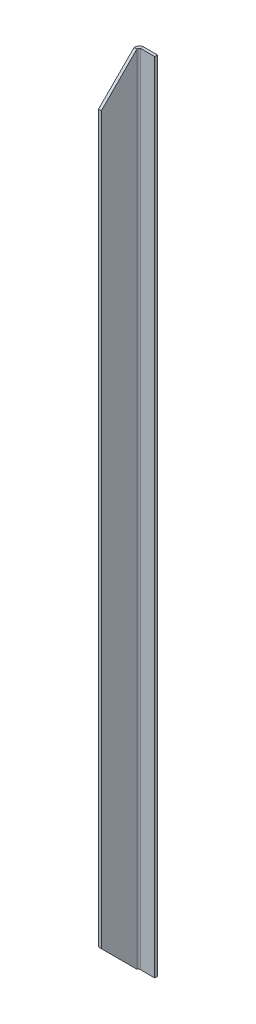
ISO-10303-21;
HEADER;
FILE_DESCRIPTION(('STEP AP214'),'2;1');
FILE_NAME('part.step','',(''),(''),'','','');
FILE_SCHEMA(('AUTOMOTIVE_DESIGN { 1 0 10303 214 1 1 1 1 }'));
ENDSEC;
DATA;
#1=APPLICATION_CONTEXT('core data for automotive mechanical design processes');
#2=APPLICATION_PROTOCOL_DEFINITION('international standard','automotive_design',2000,#1);
#3=PRODUCT_CONTEXT('',#1,'mechanical');
#4=PRODUCT('Part','Part','',(#3));
#5=PRODUCT_RELATED_PRODUCT_CATEGORY('part','',(#4));
#6=PRODUCT_DEFINITION_FORMATION('','',#4);
#7=PRODUCT_DEFINITION_CONTEXT('part definition',#1,'design');
#8=PRODUCT_DEFINITION('design','',#6,#7);
#9=PRODUCT_DEFINITION_SHAPE('','',#8);
#10=(LENGTH_UNIT() NAMED_UNIT(*) SI_UNIT(.MILLI.,.METRE.));
#11=(NAMED_UNIT(*) PLANE_ANGLE_UNIT() SI_UNIT($,.RADIAN.));
#12=(NAMED_UNIT(*) SI_UNIT($,.STERADIAN.) SOLID_ANGLE_UNIT());
#13=UNCERTAINTY_MEASURE_WITH_UNIT(LENGTH_MEASURE(1.E-05),#10,'distance_accuracy_value','');
#14=(GEOMETRIC_REPRESENTATION_CONTEXT(3) GLOBAL_UNCERTAINTY_ASSIGNED_CONTEXT((#13)) GLOBAL_UNIT_ASSIGNED_CONTEXT((#10,
#11,#12)) REPRESENTATION_CONTEXT('',''));
#15=CARTESIAN_POINT('',(0.,0.,0.));
#16=DIRECTION('',(0.,0.,1.));
#17=DIRECTION('',(1.,0.,0.));
#18=AXIS2_PLACEMENT_3D('',#15,#16,#17);
#19=CARTESIAN_POINT('',(5.77315972805081E-12,0.,610.));
#20=DIRECTION('',(0.,0.,1.));
#21=DIRECTION('',(1.,0.,0.));
#22=AXIS2_PLACEMENT_3D('',#19,#20,#21);
#23=PLANE('',#22);
#24=DIRECTION('',(0.,-1.,0.));
#25=VECTOR('',#24,1.);
#26=CARTESIAN_POINT('',(-1167.49999999999,-1197.79289321881,610.000000000011));
#27=LINE('',#26,#25);
#28=CARTESIAN_POINT('',(-1167.5,-772.207106781186,610.000000000011));
#29=VERTEX_POINT('',#28);
#30=CARTESIAN_POINT('',(-1167.49999999999,-1197.79289321881,610.000000000011));
#31=VERTEX_POINT('',#30);
#32=EDGE_CURVE('E178',#29,#31,#27,.T.);
#33=ORIENTED_EDGE('',*,*,#32,.F.);
#34=DIRECTION('',(-1.,0.,0.));
#35=VECTOR('',#34,1.);
#36=CARTESIAN_POINT('',(-1168.49999999999,-772.207106781186,610.000000000011));
#37=LINE('',#36,#35);
#38=CARTESIAN_POINT('',(-1159.99999999999,-772.207106781186,610.000000000011));
#39=VERTEX_POINT('',#38);
#40=EDGE_CURVE('E293',#39,#29,#37,.T.);
#41=ORIENTED_EDGE('',*,*,#40,.F.);
#42=DIRECTION('',(0.,1.,0.));
#43=VECTOR('',#42,1.);
#44=CARTESIAN_POINT('',(-1159.99999999999,-771.5,610.000000000011));
#45=LINE('',#44,#43);
#46=CARTESIAN_POINT('',(-1159.99999999999,-1197.79289321881,610.000000000011));
#47=VERTEX_POINT('',#46);
#48=EDGE_CURVE('E252',#47,#39,#45,.T.);
#49=ORIENTED_EDGE('',*,*,#48,.F.);
#50=DIRECTION('',(-1.,0.,0.));
#51=VECTOR('',#50,1.);
#52=CARTESIAN_POINT('',(-1168.49999999999,-1197.79289321881,610.000000000011));
#53=LINE('',#52,#51);
#54=EDGE_CURVE('E448',#47,#31,#53,.T.);
#55=ORIENTED_EDGE('',*,*,#54,.T.);
#56=EDGE_LOOP('',(#33,#41,#49,#55));
#57=FACE_BOUND('',#56,.T.);
#58=ADVANCED_FACE('F59',(#57),#23,.F.);
#59=CARTESIAN_POINT('',(1.4210854715202E-11,-1197.79289321881,1462.80373338247));
#60=DIRECTION('',(0.,1.,0.));
#61=DIRECTION('',(-1.,0.,0.));
#62=AXIS2_PLACEMENT_3D('',#59,#60,#61);
#63=PLANE('',#62);
#64=CARTESIAN_POINT('',(-1167.49999999999,-1197.79289321881,610.000000000011));
#65=CARTESIAN_POINT('',(-1167.49999999999,-1197.79289321881,611.500000000011));
#66=B_SPLINE_CURVE_WITH_KNOTS('',1,(#64,#65),.UNSPECIFIED.,.F.,.F.,(2,2),(0.,1.),.UNSPECIFIED.);
#67=CARTESIAN_POINT('',(-1167.49999999999,-1197.79289321881,611.500000000011));
#68=VERTEX_POINT('',#67);
#69=EDGE_CURVE('E422',#68,#31,#66,.F.);
#70=ORIENTED_EDGE('',*,*,#69,.T.);
#71=ORIENTED_EDGE('',*,*,#54,.F.);
#72=DIRECTION('',(0.,0.,-1.));
#73=VECTOR('',#72,1.);
#74=CARTESIAN_POINT('',(-1159.99999999998,-1197.79289321881,1462.80373338248));
#75=LINE('',#74,#73);
#76=CARTESIAN_POINT('',(-1159.99999999999,-1197.79289321881,611.500000000011));
#77=VERTEX_POINT('',#76);
#78=EDGE_CURVE('E14',#77,#47,#75,.T.);
#79=ORIENTED_EDGE('',*,*,#78,.F.);
#80=DIRECTION('',(1.,0.,0.));
#81=VECTOR('',#80,1.);
#82=CARTESIAN_POINT('',(5.88418203051333E-12,-1197.79289321881,611.5));
#83=LINE('',#82,#81);
#84=EDGE_CURVE('E443',#68,#77,#83,.T.);
#85=ORIENTED_EDGE('',*,*,#84,.F.);
#86=EDGE_LOOP('',(#70,#71,#79,#85));
#87=FACE_BOUND('',#86,.T.);
#88=ADVANCED_FACE('F61',(#87),#63,.F.);
#89=CARTESIAN_POINT('',(-1159.99999999999,0.,1462.80373338248));
#90=DIRECTION('',(-1.,0.,0.));
#91=DIRECTION('',(0.,0.,1.));
#92=AXIS2_PLACEMENT_3D('',#89,#90,#91);
#93=PLANE('',#92);
#94=ORIENTED_EDGE('',*,*,#78,.T.);
#95=ORIENTED_EDGE('',*,*,#48,.T.);
#96=DIRECTION('',(0.,0.,-1.));
#97=VECTOR('',#96,1.);
#98=CARTESIAN_POINT('',(-1159.99999999999,-772.207106781186,1462.80373338248));
#99=LINE('',#98,#97);
#100=CARTESIAN_POINT('',(-1159.99999999999,-772.207106781186,611.500000000011));
#101=VERTEX_POINT('',#100);
#102=EDGE_CURVE('E71',#101,#39,#99,.T.);
#103=ORIENTED_EDGE('',*,*,#102,.F.);
#104=DIRECTION('',(0.,1.,0.));
#105=VECTOR('',#104,1.);
#106=CARTESIAN_POINT('',(-1159.99999999999,0.,611.500000000011));
#107=LINE('',#106,#105);
#108=EDGE_CURVE('E81',#77,#101,#107,.T.);
#109=ORIENTED_EDGE('',*,*,#108,.F.);
#110=EDGE_LOOP('',(#94,#95,#103,#109));
#111=FACE_BOUND('',#110,.T.);
#112=ADVANCED_FACE('F483',(#111),#93,.F.);
#113=CARTESIAN_POINT('',(1.4210854715202E-11,-772.207106781186,1462.80373338247));
#114=DIRECTION('',(0.,-1.,0.));
#115=DIRECTION('',(1.,0.,0.));
#116=AXIS2_PLACEMENT_3D('',#113,#114,#115);
#117=PLANE('',#116);
#118=ORIENTED_EDGE('',*,*,#102,.T.);
#119=ORIENTED_EDGE('',*,*,#40,.T.);
#120=CARTESIAN_POINT('',(-1167.49999999999,-772.207106781186,611.500000000011));
#121=CARTESIAN_POINT('',(-1167.5,-772.207106781186,610.000000000011));
#122=B_SPLINE_CURVE_WITH_KNOTS('',1,(#120,#121),.UNSPECIFIED.,.F.,.F.,(2,2),(0.,1.),.UNSPECIFIED.);
#123=CARTESIAN_POINT('',(-1167.5,-772.207106781186,611.500000000011));
#124=VERTEX_POINT('',#123);
#125=EDGE_CURVE('E406',#124,#29,#122,.T.);
#126=ORIENTED_EDGE('',*,*,#125,.F.);
#127=DIRECTION('',(1.,0.,0.));
#128=VECTOR('',#127,1.);
#129=CARTESIAN_POINT('',(5.88418203051333E-12,-772.207106781186,611.5));
#130=LINE('',#129,#128);
#131=EDGE_CURVE('E90',#101,#124,#130,.F.);
#132=ORIENTED_EDGE('',*,*,#131,.F.);
#133=EDGE_LOOP('',(#118,#119,#126,#132));
#134=FACE_BOUND('',#133,.T.);
#135=ADVANCED_FACE('F487',(#134),#117,.F.);
#136=CARTESIAN_POINT('',(5.77315972805081E-12,0.,611.5));
#137=DIRECTION('',(0.,0.,1.));
#138=DIRECTION('',(1.,0.,0.));
#139=AXIS2_PLACEMENT_3D('',#136,#137,#138);
#140=PLANE('',#139);
#141=ORIENTED_EDGE('',*,*,#84,.T.);
#142=ORIENTED_EDGE('',*,*,#108,.T.);
#143=ORIENTED_EDGE('',*,*,#131,.T.);
#144=DIRECTION('',(0.,-1.,0.));
#145=VECTOR('',#144,1.);
#146=CARTESIAN_POINT('',(-1167.49999999999,-1197.79289321881,611.500000000011));
#147=LINE('',#146,#145);
#148=EDGE_CURVE('E412',#124,#68,#147,.T.);
#149=ORIENTED_EDGE('',*,*,#148,.T.);
#150=EDGE_LOOP('',(#141,#142,#143,#149));
#151=FACE_BOUND('',#150,.T.);
#152=ADVANCED_FACE('F457',(#151),#140,.T.);
#153=CARTESIAN_POINT('',(-317.651012223669,-1.00903208419055E-12,631.500000000003));
#154=DIRECTION('',(0.,0.,1.));
#155=DIRECTION('',(1.,0.,0.));
#156=AXIS2_PLACEMENT_3D('',#153,#154,#155);
#157=PLANE('',#156);
#158=DIRECTION('',(-1.,0.,0.));
#159=VECTOR('',#158,1.);
#160=CARTESIAN_POINT('',(-317.651012223665,-791.499999999997,631.500000000003));
#161=LINE('',#160,#159);
#162=CARTESIAN_POINT('',(-1168.49999999999,-791.5,631.500000000011));
#163=VERTEX_POINT('',#162);
#164=CARTESIAN_POINT('',(-1169.99999999999,-791.5,631.500000000011));
#165=VERTEX_POINT('',#164);
#166=EDGE_CURVE('E165',#163,#165,#161,.T.);
#167=ORIENTED_EDGE('',*,*,#166,.T.);
#168=DIRECTION('',(0.,1.,0.));
#169=VECTOR('',#168,1.);
#170=CARTESIAN_POINT('',(-1169.99999999999,-791.5,631.500000000011));
#171=LINE('',#170,#169);
#172=CARTESIAN_POINT('',(-1169.99999999999,-1178.5,631.500000000011));
#173=VERTEX_POINT('',#172);
#174=EDGE_CURVE('E193',#173,#165,#171,.T.);
#175=ORIENTED_EDGE('',*,*,#174,.F.);
#176=DIRECTION('',(-1.,0.,0.));
#177=VECTOR('',#176,1.);
#178=CARTESIAN_POINT('',(-317.651012223665,-1178.5,631.500000000003));
#179=LINE('',#178,#177);
#180=CARTESIAN_POINT('',(-1168.49999999999,-1178.5,631.500000000011));
#181=VERTEX_POINT('',#180);
#182=EDGE_CURVE('E188',#181,#173,#179,.T.);
#183=ORIENTED_EDGE('',*,*,#182,.F.);
#184=DIRECTION('',(0.,1.,0.));
#185=VECTOR('',#184,1.);
#186=CARTESIAN_POINT('',(-1168.5,-3.66373598126302E-12,631.500000000011));
#187=LINE('',#186,#185);
#188=EDGE_CURVE('E266',#181,#163,#187,.T.);
#189=ORIENTED_EDGE('',*,*,#188,.T.);
#190=EDGE_LOOP('',(#167,#175,#183,#189));
#191=FACE_BOUND('',#190,.T.);
#192=ADVANCED_FACE('F289',(#191),#157,.T.);
#193=CARTESIAN_POINT('',(-1168.5,-3.66373598126302E-12,1.13919852179567E-11));
#194=DIRECTION('',(-1.,0.,0.));
#195=DIRECTION('',(0.,0.,1.));
#196=AXIS2_PLACEMENT_3D('',#193,#194,#195);
#197=PLANE('',#196);
#198=DIRECTION('',(0.,1.,0.));
#199=VECTOR('',#198,1.);
#200=CARTESIAN_POINT('',(-1168.5,-3.66373598126302E-12,612.500000000011));
#201=LINE('',#200,#199);
#202=CARTESIAN_POINT('',(-1168.49999999999,-772.5,612.500000000011));
#203=VERTEX_POINT('',#202);
#204=CARTESIAN_POINT('',(-1168.49999999999,-1197.5,612.500000000011));
#205=VERTEX_POINT('',#204);
#206=EDGE_CURVE('E166',#203,#205,#201,.F.);
#207=ORIENTED_EDGE('',*,*,#206,.F.);
#208=DIRECTION('',(0.,-0.707106781186546,0.70710678118655));
#209=VECTOR('',#208,1.);
#210=CARTESIAN_POINT('',(-1168.5,-80.000000000004,-79.9999999999885));
#211=LINE('',#210,#209);
#212=EDGE_CURVE('E271',#203,#163,#211,.T.);
#213=ORIENTED_EDGE('',*,*,#212,.T.);
#214=ORIENTED_EDGE('',*,*,#188,.F.);
#215=DIRECTION('',(0.,-0.707106781186548,-0.707106781186548));
#216=VECTOR('',#215,1.);
#217=CARTESIAN_POINT('',(-1168.49999999999,-905.000000000002,905.00000000001));
#218=LINE('',#217,#216);
#219=EDGE_CURVE('E275',#181,#205,#218,.T.);
#220=ORIENTED_EDGE('',*,*,#219,.T.);
#221=EDGE_LOOP('',(#207,#213,#214,#220));
#222=FACE_BOUND('',#221,.T.);
#223=ADVANCED_FACE('F229',(#222),#197,.F.);
#224=CARTESIAN_POINT('',(-317.651012223675,-80.0000000000013,-79.9999999999967));
#225=DIRECTION('',(0.,-0.707106781186549,-0.707106781186546));
#226=DIRECTION('',(0.,0.707106781186546,-0.707106781186549));
#227=AXIS2_PLACEMENT_3D('',#224,#225,#226);
#228=PLANE('',#227);
#229=DIRECTION('',(0.,-0.707106781186546,0.70710678118655));
#230=VECTOR('',#229,1.);
#231=CARTESIAN_POINT('',(-1170.,-80.000000000004,-79.9999999999884));
#232=LINE('',#231,#230);
#233=CARTESIAN_POINT('',(-1169.99999999999,-772.5,612.500000000011));
#234=VERTEX_POINT('',#233);
#235=EDGE_CURVE('E198',#234,#165,#232,.T.);
#236=ORIENTED_EDGE('',*,*,#235,.T.);
#237=ORIENTED_EDGE('',*,*,#166,.F.);
#238=ORIENTED_EDGE('',*,*,#212,.F.);
#239=CARTESIAN_POINT('',(-1169.99999999999,-772.5,612.500000000011));
#240=CARTESIAN_POINT('',(-1168.49999999999,-772.5,612.500000000011));
#241=B_SPLINE_CURVE_WITH_KNOTS('',1,(#239,#240),.UNSPECIFIED.,.F.,.F.,(2,2),(0.,1.),.UNSPECIFIED.);
#242=EDGE_CURVE('E200',#203,#234,#241,.F.);
#243=ORIENTED_EDGE('',*,*,#242,.T.);
#244=EDGE_LOOP('',(#236,#237,#238,#243));
#245=FACE_BOUND('',#244,.T.);
#246=ADVANCED_FACE('F219',(#245),#228,.F.);
#247=CARTESIAN_POINT('',(-1170.,-3.66373598126302E-12,1.14066090757461E-11));
#248=DIRECTION('',(-1.,0.,0.));
#249=DIRECTION('',(0.,0.,1.));
#250=AXIS2_PLACEMENT_3D('',#247,#248,#249);
#251=PLANE('',#250);
#252=ORIENTED_EDGE('',*,*,#235,.F.);
#253=DIRECTION('',(0.,1.,0.));
#254=VECTOR('',#253,1.);
#255=CARTESIAN_POINT('',(-1170.,-3.66373598126302E-12,612.500000000011));
#256=LINE('',#255,#254);
#257=CARTESIAN_POINT('',(-1169.99999999999,-1197.5,612.500000000011));
#258=VERTEX_POINT('',#257);
#259=EDGE_CURVE('E176',#234,#258,#256,.F.);
#260=ORIENTED_EDGE('',*,*,#259,.T.);
#261=DIRECTION('',(0.,-0.707106781186548,-0.707106781186548));
#262=VECTOR('',#261,1.);
#263=CARTESIAN_POINT('',(-1169.99999999999,-905.000000000002,905.00000000001));
#264=LINE('',#263,#262);
#265=EDGE_CURVE('E185',#173,#258,#264,.T.);
#266=ORIENTED_EDGE('',*,*,#265,.F.);
#267=ORIENTED_EDGE('',*,*,#174,.T.);
#268=EDGE_LOOP('',(#252,#260,#266,#267));
#269=FACE_BOUND('',#268,.T.);
#270=ADVANCED_FACE('F197',(#269),#251,.T.);
#271=CARTESIAN_POINT('',(-317.651012223664,-904.999999999999,905.000000000001));
#272=DIRECTION('',(0.,0.707106781186547,-0.707106781186547));
#273=DIRECTION('',(0.,0.707106781186548,0.707106781186548));
#274=AXIS2_PLACEMENT_3D('',#271,#272,#273);
#275=PLANE('',#274);
#276=ORIENTED_EDGE('',*,*,#265,.T.);
#277=CARTESIAN_POINT('',(-1168.49999999999,-1197.5,612.500000000011));
#278=CARTESIAN_POINT('',(-1169.99999999999,-1197.5,612.500000000011));
#279=B_SPLINE_CURVE_WITH_KNOTS('',1,(#277,#278),.UNSPECIFIED.,.F.,.F.,(2,2),(0.,1.),.UNSPECIFIED.);
#280=EDGE_CURVE('E149',#205,#258,#279,.T.);
#281=ORIENTED_EDGE('',*,*,#280,.F.);
#282=ORIENTED_EDGE('',*,*,#219,.F.);
#283=ORIENTED_EDGE('',*,*,#182,.T.);
#284=EDGE_LOOP('',(#276,#281,#282,#283));
#285=FACE_BOUND('',#284,.T.);
#286=ADVANCED_FACE('F186',(#285),#275,.F.);
#287=CARTESIAN_POINT('',(-1167.49999999999,-1197.79289321881,610.000000000011));
#288=CARTESIAN_POINT('',(-1167.82730791048,-1197.76848107427,610.000000000011));
#289=CARTESIAN_POINT('',(-1168.15436971089,-1197.74407768234,610.06506830834));
#290=CARTESIAN_POINT('',(-1168.75904745092,-1197.69526214588,610.315534029125));
#291=CARTESIAN_POINT('',(-1169.03636679993,-1197.67085437764,610.500832894015));
#292=CARTESIAN_POINT('',(-1169.49916710599,-1197.62203884117,610.963633200073));
#293=CARTESIAN_POINT('',(-1169.68446597088,-1197.59763107294,611.240952549084));
#294=CARTESIAN_POINT('',(-1169.93493169166,-1197.54881553647,611.845630289113));
#295=CARTESIAN_POINT('',(-1169.99999999999,-1197.52441214454,612.172692089522));
#296=CARTESIAN_POINT('',(-1169.99999999999,-1197.5,612.500000000011));
#297=CARTESIAN_POINT('',(-1167.49999999999,-1197.79289321881,611.500000000011));
#298=CARTESIAN_POINT('',(-1167.63092250177,-1197.76848119779,611.500000000011));
#299=CARTESIAN_POINT('',(-1167.76174788435,-1197.74407768234,611.526027323343));
#300=CARTESIAN_POINT('',(-1168.00361898036,-1197.69526214588,611.626213611657));
#301=CARTESIAN_POINT('',(-1168.11454671997,-1197.67085437764,611.700333157613));
#302=CARTESIAN_POINT('',(-1168.29966684239,-1197.62203884117,611.885453280036));
#303=CARTESIAN_POINT('',(-1168.37378638835,-1197.59763107294,611.99638101964));
#304=CARTESIAN_POINT('',(-1168.47397267666,-1197.54881553647,612.238252115652));
#305=CARTESIAN_POINT('',(-1168.49999999999,-1197.52441202103,612.369077498236));
#306=CARTESIAN_POINT('',(-1168.49999999999,-1197.5,612.500000000011));
#307=B_SPLINE_SURFACE_WITH_KNOTS('',1,3,((#287,#288,#289,#290,#291,#292,#293,#294,#295,#296),
(#297,#298,#299,#300,#301,#302,#303,#304,#305,#306)),.UNSPECIFIED.,.F.,.F.,.F.,(2,2),(4,2,2,2,
4),(0.,1.),(0.,0.25,0.5,0.75,1.),.UNSPECIFIED.);
#308=CARTESIAN_POINT('',(-1167.49999999999,-1197.79289321881,611.500000000011));
#309=CARTESIAN_POINT('',(-1167.63092250177,-1197.76848119779,611.500000000011));
#310=CARTESIAN_POINT('',(-1167.76174788435,-1197.74407768234,611.526027323343));
#311=CARTESIAN_POINT('',(-1168.00361898036,-1197.69526214588,611.626213611657));
#312=CARTESIAN_POINT('',(-1168.11454671997,-1197.67085437764,611.700333157613));
#313=CARTESIAN_POINT('',(-1168.29966684239,-1197.62203884117,611.885453280036));
#314=CARTESIAN_POINT('',(-1168.37378638835,-1197.59763107294,611.99638101964));
#315=CARTESIAN_POINT('',(-1168.47397267666,-1197.54881553647,612.238252115652));
#316=CARTESIAN_POINT('',(-1168.49999999999,-1197.52441202103,612.369077498236));
#317=CARTESIAN_POINT('',(-1168.49999999999,-1197.5,612.500000000011));
#318=B_SPLINE_CURVE_WITH_KNOTS('',3,(#308,#309,#310,#311,#312,#313,#314,#315,#316,#317),
.UNSPECIFIED.,.F.,.F.,(4,2,2,2,4),(0.,0.25,0.5,0.75,1.),.UNSPECIFIED.);
#319=EDGE_CURVE('E157',#68,#205,#318,.T.);
#320=CARTESIAN_POINT('',(-1169.99999999999,-1197.5,612.500000000011));
#321=CARTESIAN_POINT('',(-1169.99999999999,-1197.52441214454,612.172692089522));
#322=CARTESIAN_POINT('',(-1169.93493169166,-1197.54881553647,611.845630289113));
#323=CARTESIAN_POINT('',(-1169.68446597088,-1197.59763107294,611.240952549084));
#324=CARTESIAN_POINT('',(-1169.49916710599,-1197.62203884117,610.963633200073));
#325=CARTESIAN_POINT('',(-1169.03636679993,-1197.67085437764,610.500832894015));
#326=CARTESIAN_POINT('',(-1168.75904745092,-1197.69526214588,610.315534029125));
#327=CARTESIAN_POINT('',(-1168.15436971089,-1197.74407768234,610.06506830834));
#328=CARTESIAN_POINT('',(-1167.82730791048,-1197.76848107427,610.000000000011));
#329=CARTESIAN_POINT('',(-1167.49999999999,-1197.79289321881,610.000000000011));
#330=B_SPLINE_CURVE_WITH_KNOTS('',3,(#320,#321,#322,#323,#324,#325,#326,#327,#328,#329),
.UNSPECIFIED.,.F.,.F.,(4,2,2,2,4),(0.,0.25,0.5,0.75,1.),.UNSPECIFIED.);
#331=EDGE_CURVE('E154',#31,#258,#330,.F.);
#332=ORIENTED_EDGE('',*,*,#69,.F.);
#333=ORIENTED_EDGE('',*,*,#319,.T.);
#334=ORIENTED_EDGE('',*,*,#280,.T.);
#335=ORIENTED_EDGE('',*,*,#331,.F.);
#336=EDGE_LOOP('',(#332,#333,#334,#335));
#337=FACE_BOUND('',#336,.T.);
#338=ADVANCED_FACE('F153',(#337),#307,.T.);
#339=CARTESIAN_POINT('',(-1169.99999999999,-772.5,612.500000000011));
#340=CARTESIAN_POINT('',(-1169.99999999999,-772.475587855456,612.172692089522));
#341=CARTESIAN_POINT('',(-1169.93493169167,-772.451184463531,611.845630289113));
#342=CARTESIAN_POINT('',(-1169.68446597088,-772.402368927062,611.240952549084));
#343=CARTESIAN_POINT('',(-1169.49916710599,-772.377961158827,610.963633200074));
#344=CARTESIAN_POINT('',(-1169.03636679993,-772.329145622359,610.500832894016));
#345=CARTESIAN_POINT('',(-1168.75904745092,-772.304737854124,610.315534029126));
#346=CARTESIAN_POINT('',(-1168.15436971089,-772.255922317655,610.065068308341));
#347=CARTESIAN_POINT('',(-1167.82730791048,-772.23151892573,610.000000000011));
#348=CARTESIAN_POINT('',(-1167.5,-772.207106781186,610.000000000011));
#349=CARTESIAN_POINT('',(-1168.49999999999,-772.5,612.500000000011));
#350=CARTESIAN_POINT('',(-1168.49999999999,-772.475587978972,612.369077498236));
#351=CARTESIAN_POINT('',(-1168.47397267666,-772.451184463531,612.238252115652));
#352=CARTESIAN_POINT('',(-1168.37378638835,-772.402368927062,611.99638101964));
#353=CARTESIAN_POINT('',(-1168.29966684239,-772.377961158827,611.885453280036));
#354=CARTESIAN_POINT('',(-1168.11454671997,-772.329145622359,611.700333157613));
#355=CARTESIAN_POINT('',(-1168.00361898037,-772.304737854124,611.626213611657));
#356=CARTESIAN_POINT('',(-1167.76174788435,-772.255922317655,611.526027323343));
#357=CARTESIAN_POINT('',(-1167.63092250177,-772.231518802214,611.500000000011));
#358=CARTESIAN_POINT('',(-1167.49999999999,-772.207106781186,611.500000000011));
#359=B_SPLINE_SURFACE_WITH_KNOTS('',1,3,((#339,#340,#341,#342,#343,#344,#345,#346,#347,#348),
(#349,#350,#351,#352,#353,#354,#355,#356,#357,#358)),.UNSPECIFIED.,.F.,.F.,.F.,(2,2),(4,2,2,2,
4),(0.,1.),(0.,0.25,0.5,0.75,1.),.UNSPECIFIED.);
#360=CARTESIAN_POINT('',(-1168.49999999999,-772.5,612.500000000011));
#361=CARTESIAN_POINT('',(-1168.49999999999,-772.475587978972,612.369077498236));
#362=CARTESIAN_POINT('',(-1168.47397267666,-772.451184463531,612.238252115652));
#363=CARTESIAN_POINT('',(-1168.37378638835,-772.402368927062,611.99638101964));
#364=CARTESIAN_POINT('',(-1168.29966684239,-772.377961158827,611.885453280036));
#365=CARTESIAN_POINT('',(-1168.11454671997,-772.329145622359,611.700333157613));
#366=CARTESIAN_POINT('',(-1168.00361898037,-772.304737854124,611.626213611657));
#367=CARTESIAN_POINT('',(-1167.76174788435,-772.255922317655,611.526027323343));
#368=CARTESIAN_POINT('',(-1167.63092250177,-772.231518802214,611.500000000011));
#369=CARTESIAN_POINT('',(-1167.49999999999,-772.207106781186,611.500000000011));
#370=B_SPLINE_CURVE_WITH_KNOTS('',3,(#360,#361,#362,#363,#364,#365,#366,#367,#368,#369),
.UNSPECIFIED.,.F.,.F.,(4,2,2,2,4),(0.,0.25,0.5,0.75,1.),.UNSPECIFIED.);
#371=EDGE_CURVE('E181',#203,#124,#370,.T.);
#372=CARTESIAN_POINT('',(-1167.5,-772.207106781186,610.000000000011));
#373=CARTESIAN_POINT('',(-1167.82730791048,-772.23151892573,610.000000000011));
#374=CARTESIAN_POINT('',(-1168.15436971089,-772.255922317655,610.065068308341));
#375=CARTESIAN_POINT('',(-1168.75904745092,-772.304737854124,610.315534029126));
#376=CARTESIAN_POINT('',(-1169.03636679993,-772.329145622359,610.500832894016));
#377=CARTESIAN_POINT('',(-1169.49916710599,-772.377961158827,610.963633200074));
#378=CARTESIAN_POINT('',(-1169.68446597088,-772.402368927062,611.240952549084));
#379=CARTESIAN_POINT('',(-1169.93493169167,-772.451184463531,611.845630289113));
#380=CARTESIAN_POINT('',(-1169.99999999999,-772.475587855456,612.172692089522));
#381=CARTESIAN_POINT('',(-1169.99999999999,-772.5,612.500000000011));
#382=B_SPLINE_CURVE_WITH_KNOTS('',3,(#372,#373,#374,#375,#376,#377,#378,#379,#380,#381),
.UNSPECIFIED.,.F.,.F.,(4,2,2,2,4),(0.,0.25,0.5,0.75,1.),.UNSPECIFIED.);
#383=EDGE_CURVE('E180',#234,#29,#382,.F.);
#384=ORIENTED_EDGE('',*,*,#371,.T.);
#385=ORIENTED_EDGE('',*,*,#125,.T.);
#386=ORIENTED_EDGE('',*,*,#383,.F.);
#387=ORIENTED_EDGE('',*,*,#242,.F.);
#388=EDGE_LOOP('',(#384,#385,#386,#387));
#389=FACE_BOUND('',#388,.T.);
#390=ADVANCED_FACE('F329',(#389),#359,.T.);
#391=CARTESIAN_POINT('',(-1167.49999999999,-1624.2217759684,612.500000000011));
#392=DIRECTION('',(0.,1.,0.));
#393=DIRECTION('',(-1.,0.,0.));
#394=AXIS2_PLACEMENT_3D('',#391,#392,#393);
#395=CYLINDRICAL_SURFACE('',#394,2.50000000000014);
#396=ORIENTED_EDGE('',*,*,#259,.F.);
#397=ORIENTED_EDGE('',*,*,#383,.T.);
#398=ORIENTED_EDGE('',*,*,#32,.T.);
#399=ORIENTED_EDGE('',*,*,#331,.T.);
#400=EDGE_LOOP('',(#396,#397,#398,#399));
#401=FACE_BOUND('',#400,.T.);
#402=ADVANCED_FACE('F173',(#401),#395,.T.);
#403=CARTESIAN_POINT('',(-1167.49999999999,-1624.2217759684,612.500000000011));
#404=DIRECTION('',(0.,1.,0.));
#405=DIRECTION('',(-1.,0.,0.));
#406=AXIS2_PLACEMENT_3D('',#403,#404,#405);
#407=CYLINDRICAL_SURFACE('',#406,1.00000000000008);
#408=ORIENTED_EDGE('',*,*,#206,.T.);
#409=ORIENTED_EDGE('',*,*,#319,.F.);
#410=ORIENTED_EDGE('',*,*,#148,.F.);
#411=ORIENTED_EDGE('',*,*,#371,.F.);
#412=EDGE_LOOP('',(#408,#409,#410,#411));
#413=FACE_BOUND('',#412,.T.);
#414=ADVANCED_FACE('F328',(#413),#407,.F.);
#415=CLOSED_SHELL('',(#58,#88,#112,#135,#152,#192,#223,#246,#270,#286,#338,#390,#402,#414));
#416=MANIFOLD_SOLID_BREP('B2',#415);
#417=ADVANCED_BREP_SHAPE_REPRESENTATION('',(#18,#416),#14);
#418=SHAPE_DEFINITION_REPRESENTATION(#9,#417);
ENDSEC;
END-ISO-10303-21;
